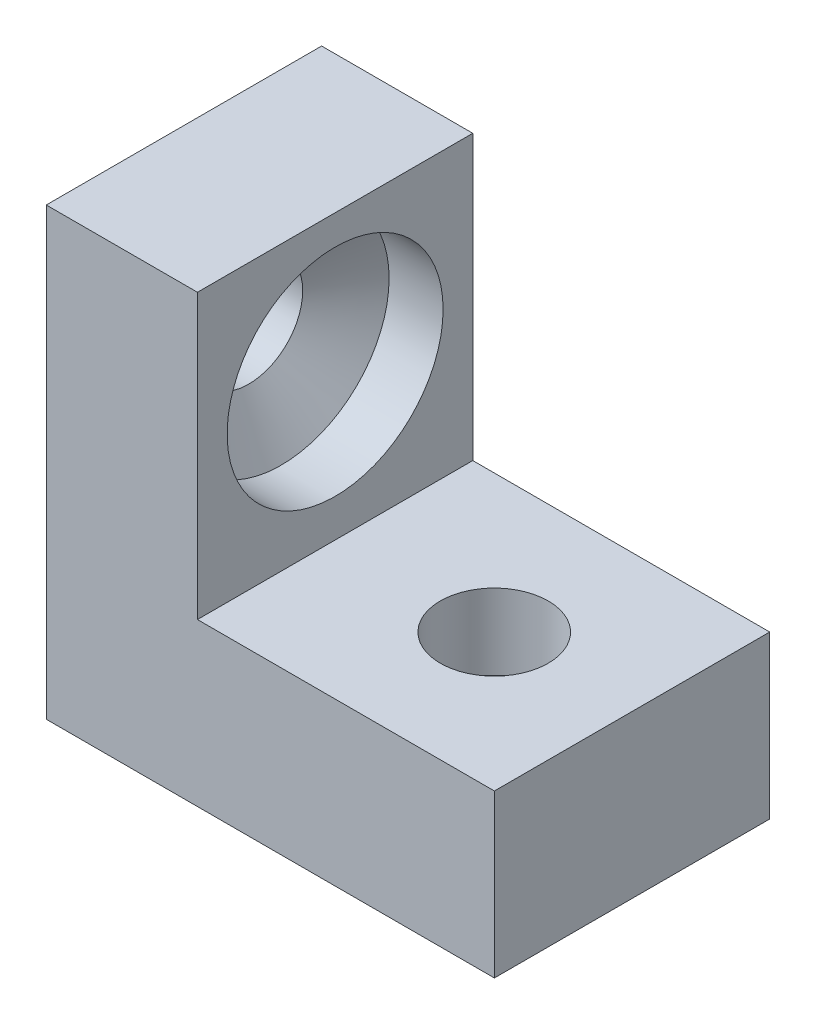
ISO-10303-21;
HEADER;
FILE_DESCRIPTION(('STEP AP214'),'2;1');
FILE_NAME('part.step','',(''),(''),'','','');
FILE_SCHEMA(('AUTOMOTIVE_DESIGN { 1 0 10303 214 1 1 1 1 }'));
ENDSEC;
DATA;
#1=APPLICATION_CONTEXT('core data for automotive mechanical design processes');
#2=APPLICATION_PROTOCOL_DEFINITION('international standard','automotive_design',2000,#1);
#3=PRODUCT_CONTEXT('',#1,'mechanical');
#4=PRODUCT('Part','Part','',(#3));
#5=PRODUCT_RELATED_PRODUCT_CATEGORY('part','',(#4));
#6=PRODUCT_DEFINITION_FORMATION('','',#4);
#7=PRODUCT_DEFINITION_CONTEXT('part definition',#1,'design');
#8=PRODUCT_DEFINITION('design','',#6,#7);
#9=PRODUCT_DEFINITION_SHAPE('','',#8);
#10=(LENGTH_UNIT() NAMED_UNIT(*) SI_UNIT(.MILLI.,.METRE.));
#11=(NAMED_UNIT(*) PLANE_ANGLE_UNIT() SI_UNIT($,.RADIAN.));
#12=(NAMED_UNIT(*) SI_UNIT($,.STERADIAN.) SOLID_ANGLE_UNIT());
#13=UNCERTAINTY_MEASURE_WITH_UNIT(LENGTH_MEASURE(1.E-05),#10,'distance_accuracy_value','');
#14=(GEOMETRIC_REPRESENTATION_CONTEXT(3) GLOBAL_UNCERTAINTY_ASSIGNED_CONTEXT((#13)) GLOBAL_UNIT_ASSIGNED_CONTEXT((#10,
#11,#12)) REPRESENTATION_CONTEXT('',''));
#15=CARTESIAN_POINT('',(0.,0.,0.));
#16=DIRECTION('',(0.,0.,1.));
#17=DIRECTION('',(1.,0.,0.));
#18=AXIS2_PLACEMENT_3D('',#15,#16,#17);
#19=CARTESIAN_POINT('',(0.,3.,0.));
#20=DIRECTION('',(0.,-1.,0.));
#21=DIRECTION('',(0.,0.,-1.));
#22=AXIS2_PLACEMENT_3D('',#19,#20,#21);
#23=PLANE('',#22);
#24=CARTESIAN_POINT('',(5.75023739748204,3.,-2.5473170362118));
#25=DIRECTION('',(0.,-1.,0.));
#26=DIRECTION('',(0.,0.,-1.));
#27=AXIS2_PLACEMENT_3D('',#24,#25,#26);
#28=CIRCLE('',#27,1.);
#29=CARTESIAN_POINT('',(5.75023739748204,3.,-3.54731703621181));
#30=VERTEX_POINT('',#29);
#31=EDGE_CURVE('E43',#30,#30,#28,.T.);
#32=ORIENTED_EDGE('',*,*,#31,.T.);
#33=EDGE_LOOP('',(#32));
#34=FACE_BOUND('',#33,.T.);
#35=DIRECTION('',(0.,0.,-1.));
#36=VECTOR('',#35,1.);
#37=CARTESIAN_POINT('',(2.8,3.,0.));
#38=LINE('',#37,#36);
#39=CARTESIAN_POINT('',(2.8,3.,0.));
#40=VERTEX_POINT('',#39);
#41=CARTESIAN_POINT('',(2.8,3.,-5.1));
#42=VERTEX_POINT('',#41);
#43=EDGE_CURVE('E56',#40,#42,#38,.T.);
#44=ORIENTED_EDGE('',*,*,#43,.F.);
#45=DIRECTION('',(1.,0.,0.));
#46=VECTOR('',#45,1.);
#47=CARTESIAN_POINT('',(0.,3.,0.));
#48=LINE('',#47,#46);
#49=CARTESIAN_POINT('',(8.3,3.,0.));
#50=VERTEX_POINT('',#49);
#51=EDGE_CURVE('E93',#40,#50,#48,.T.);
#52=ORIENTED_EDGE('',*,*,#51,.T.);
#53=DIRECTION('',(0.,0.,-1.));
#54=VECTOR('',#53,1.);
#55=CARTESIAN_POINT('',(8.3,3.,0.));
#56=LINE('',#55,#54);
#57=CARTESIAN_POINT('',(8.3,3.,-5.1));
#58=VERTEX_POINT('',#57);
#59=EDGE_CURVE('E62',#50,#58,#56,.T.);
#60=ORIENTED_EDGE('',*,*,#59,.T.);
#61=DIRECTION('',(-1.,0.,0.));
#62=VECTOR('',#61,1.);
#63=CARTESIAN_POINT('',(0.,3.,-5.1));
#64=LINE('',#63,#62);
#65=EDGE_CURVE('E103',#58,#42,#64,.T.);
#66=ORIENTED_EDGE('',*,*,#65,.T.);
#67=EDGE_LOOP('',(#44,#52,#60,#66));
#68=FACE_BOUND('',#67,.T.);
#69=ADVANCED_FACE('F39',(#34,#68),#23,.F.);
#70=CARTESIAN_POINT('',(0.,3.,0.));
#71=DIRECTION('',(1.,0.,0.));
#72=DIRECTION('',(0.,0.,-1.));
#73=AXIS2_PLACEMENT_3D('',#70,#71,#72);
#74=PLANE('',#73);
#75=CARTESIAN_POINT('',(0.,5.7,-2.55));
#76=DIRECTION('',(1.,0.,0.));
#77=DIRECTION('',(0.,0.,-1.));
#78=AXIS2_PLACEMENT_3D('',#75,#76,#77);
#79=CIRCLE('',#78,1.);
#80=CARTESIAN_POINT('',(0.,5.7,-3.55));
#81=VERTEX_POINT('',#80);
#82=EDGE_CURVE('E137',#81,#81,#79,.T.);
#83=ORIENTED_EDGE('',*,*,#82,.T.);
#84=EDGE_LOOP('',(#83));
#85=FACE_BOUND('',#84,.T.);
#86=DIRECTION('',(0.,0.,1.));
#87=VECTOR('',#86,1.);
#88=CARTESIAN_POINT('',(0.,0.,0.));
#89=LINE('',#88,#87);
#90=CARTESIAN_POINT('',(0.,0.,-5.1));
#91=VERTEX_POINT('',#90);
#92=CARTESIAN_POINT('',(0.,0.,0.));
#93=VERTEX_POINT('',#92);
#94=EDGE_CURVE('E100',#91,#93,#89,.T.);
#95=ORIENTED_EDGE('',*,*,#94,.T.);
#96=DIRECTION('',(0.,-1.,0.));
#97=VECTOR('',#96,1.);
#98=CARTESIAN_POINT('',(0.,3.,0.));
#99=LINE('',#98,#97);
#100=CARTESIAN_POINT('',(0.,8.25,0.));
#101=VERTEX_POINT('',#100);
#102=EDGE_CURVE('E11',#101,#93,#99,.T.);
#103=ORIENTED_EDGE('',*,*,#102,.F.);
#104=DIRECTION('',(0.,0.,1.));
#105=VECTOR('',#104,1.);
#106=CARTESIAN_POINT('',(0.,8.25,0.));
#107=LINE('',#106,#105);
#108=CARTESIAN_POINT('',(0.,8.25,-5.1));
#109=VERTEX_POINT('',#108);
#110=EDGE_CURVE('E102',#109,#101,#107,.T.);
#111=ORIENTED_EDGE('',*,*,#110,.F.);
#112=DIRECTION('',(0.,-1.,0.));
#113=VECTOR('',#112,1.);
#114=CARTESIAN_POINT('',(0.,3.,-5.1));
#115=LINE('',#114,#113);
#116=EDGE_CURVE('E86',#109,#91,#115,.T.);
#117=ORIENTED_EDGE('',*,*,#116,.T.);
#118=EDGE_LOOP('',(#95,#103,#111,#117));
#119=FACE_BOUND('',#118,.T.);
#120=ADVANCED_FACE('F41',(#85,#119),#74,.F.);
#121=CARTESIAN_POINT('',(0.,3.,0.));
#122=DIRECTION('',(0.,0.,-1.));
#123=DIRECTION('',(-1.,0.,0.));
#124=AXIS2_PLACEMENT_3D('',#121,#122,#123);
#125=PLANE('',#124);
#126=DIRECTION('',(1.,0.,0.));
#127=VECTOR('',#126,1.);
#128=CARTESIAN_POINT('',(0.,0.,0.));
#129=LINE('',#128,#127);
#130=CARTESIAN_POINT('',(8.3,0.,0.));
#131=VERTEX_POINT('',#130);
#132=EDGE_CURVE('E106',#93,#131,#129,.T.);
#133=ORIENTED_EDGE('',*,*,#132,.T.);
#134=DIRECTION('',(0.,-1.,0.));
#135=VECTOR('',#134,1.);
#136=CARTESIAN_POINT('',(8.3,3.,0.));
#137=LINE('',#136,#135);
#138=EDGE_CURVE('E48',#50,#131,#137,.T.);
#139=ORIENTED_EDGE('',*,*,#138,.F.);
#140=ORIENTED_EDGE('',*,*,#51,.F.);
#141=DIRECTION('',(0.,-1.,0.));
#142=VECTOR('',#141,1.);
#143=CARTESIAN_POINT('',(2.8,8.25,0.));
#144=LINE('',#143,#142);
#145=CARTESIAN_POINT('',(2.8,8.25,0.));
#146=VERTEX_POINT('',#145);
#147=EDGE_CURVE('E107',#146,#40,#144,.T.);
#148=ORIENTED_EDGE('',*,*,#147,.F.);
#149=DIRECTION('',(1.,0.,0.));
#150=VECTOR('',#149,1.);
#151=CARTESIAN_POINT('',(0.,8.25,0.));
#152=LINE('',#151,#150);
#153=EDGE_CURVE('E146',#101,#146,#152,.T.);
#154=ORIENTED_EDGE('',*,*,#153,.F.);
#155=ORIENTED_EDGE('',*,*,#102,.T.);
#156=EDGE_LOOP('',(#133,#139,#140,#148,#154,#155));
#157=FACE_BOUND('',#156,.T.);
#158=ADVANCED_FACE('F192',(#157),#125,.F.);
#159=CARTESIAN_POINT('',(8.3,3.,0.));
#160=DIRECTION('',(-1.,0.,0.));
#161=DIRECTION('',(0.,0.,1.));
#162=AXIS2_PLACEMENT_3D('',#159,#160,#161);
#163=PLANE('',#162);
#164=DIRECTION('',(0.,0.,-1.));
#165=VECTOR('',#164,1.);
#166=CARTESIAN_POINT('',(8.3,0.,0.));
#167=LINE('',#166,#165);
#168=CARTESIAN_POINT('',(8.3,0.,-5.1));
#169=VERTEX_POINT('',#168);
#170=EDGE_CURVE('E94',#131,#169,#167,.T.);
#171=ORIENTED_EDGE('',*,*,#170,.T.);
#172=DIRECTION('',(0.,-1.,0.));
#173=VECTOR('',#172,1.);
#174=CARTESIAN_POINT('',(8.3,3.,-5.1));
#175=LINE('',#174,#173);
#176=EDGE_CURVE('E89',#58,#169,#175,.T.);
#177=ORIENTED_EDGE('',*,*,#176,.F.);
#178=ORIENTED_EDGE('',*,*,#59,.F.);
#179=ORIENTED_EDGE('',*,*,#138,.T.);
#180=EDGE_LOOP('',(#171,#177,#178,#179));
#181=FACE_BOUND('',#180,.T.);
#182=ADVANCED_FACE('F184',(#181),#163,.F.);
#183=CARTESIAN_POINT('',(0.,3.,-5.1));
#184=DIRECTION('',(0.,0.,1.));
#185=DIRECTION('',(1.,0.,0.));
#186=AXIS2_PLACEMENT_3D('',#183,#184,#185);
#187=PLANE('',#186);
#188=DIRECTION('',(-1.,0.,0.));
#189=VECTOR('',#188,1.);
#190=CARTESIAN_POINT('',(0.,0.,-5.1));
#191=LINE('',#190,#189);
#192=EDGE_CURVE('E82',#169,#91,#191,.T.);
#193=ORIENTED_EDGE('',*,*,#192,.T.);
#194=ORIENTED_EDGE('',*,*,#116,.F.);
#195=DIRECTION('',(-1.,0.,0.));
#196=VECTOR('',#195,1.);
#197=CARTESIAN_POINT('',(0.,8.25,-5.1));
#198=LINE('',#197,#196);
#199=CARTESIAN_POINT('',(2.8,8.25,-5.1));
#200=VERTEX_POINT('',#199);
#201=EDGE_CURVE('E138',#200,#109,#198,.T.);
#202=ORIENTED_EDGE('',*,*,#201,.F.);
#203=DIRECTION('',(0.,-1.,0.));
#204=VECTOR('',#203,1.);
#205=CARTESIAN_POINT('',(2.8,8.25,-5.1));
#206=LINE('',#205,#204);
#207=EDGE_CURVE('E111',#200,#42,#206,.T.);
#208=ORIENTED_EDGE('',*,*,#207,.T.);
#209=ORIENTED_EDGE('',*,*,#65,.F.);
#210=ORIENTED_EDGE('',*,*,#176,.T.);
#211=EDGE_LOOP('',(#193,#194,#202,#208,#209,#210));
#212=FACE_BOUND('',#211,.T.);
#213=ADVANCED_FACE('F84',(#212),#187,.F.);
#214=CARTESIAN_POINT('',(0.,0.,0.));
#215=DIRECTION('',(0.,-1.,0.));
#216=DIRECTION('',(0.,0.,-1.));
#217=AXIS2_PLACEMENT_3D('',#214,#215,#216);
#218=PLANE('',#217);
#219=CARTESIAN_POINT('',(5.75023739748204,0.,-2.5473170362118));
#220=DIRECTION('',(0.,-1.,0.));
#221=DIRECTION('',(0.,0.,-1.));
#222=AXIS2_PLACEMENT_3D('',#219,#220,#221);
#223=CIRCLE('',#222,2.);
#224=CARTESIAN_POINT('',(5.75023739748204,0.,-4.54731703621181));
#225=VERTEX_POINT('',#224);
#226=EDGE_CURVE('E169',#225,#225,#223,.T.);
#227=ORIENTED_EDGE('',*,*,#226,.F.);
#228=EDGE_LOOP('',(#227));
#229=FACE_BOUND('',#228,.T.);
#230=ORIENTED_EDGE('',*,*,#94,.F.);
#231=ORIENTED_EDGE('',*,*,#192,.F.);
#232=ORIENTED_EDGE('',*,*,#170,.F.);
#233=ORIENTED_EDGE('',*,*,#132,.F.);
#234=EDGE_LOOP('',(#230,#231,#232,#233));
#235=FACE_BOUND('',#234,.T.);
#236=ADVANCED_FACE('F105',(#229,#235),#218,.T.);
#237=CARTESIAN_POINT('',(2.8,8.25,0.));
#238=DIRECTION('',(-1.,0.,0.));
#239=DIRECTION('',(0.,0.,1.));
#240=AXIS2_PLACEMENT_3D('',#237,#238,#239);
#241=PLANE('',#240);
#242=CARTESIAN_POINT('',(2.8,5.7,-2.55));
#243=DIRECTION('',(1.,0.,0.));
#244=DIRECTION('',(0.,0.,-1.));
#245=AXIS2_PLACEMENT_3D('',#242,#243,#244);
#246=CIRCLE('',#245,2.);
#247=CARTESIAN_POINT('',(2.8,5.7,-4.55));
#248=VERTEX_POINT('',#247);
#249=EDGE_CURVE('E160',#248,#248,#246,.T.);
#250=ORIENTED_EDGE('',*,*,#249,.F.);
#251=EDGE_LOOP('',(#250));
#252=FACE_BOUND('',#251,.T.);
#253=ORIENTED_EDGE('',*,*,#43,.T.);
#254=ORIENTED_EDGE('',*,*,#207,.F.);
#255=DIRECTION('',(0.,0.,-1.));
#256=VECTOR('',#255,1.);
#257=CARTESIAN_POINT('',(2.8,8.25,0.));
#258=LINE('',#257,#256);
#259=EDGE_CURVE('E140',#146,#200,#258,.T.);
#260=ORIENTED_EDGE('',*,*,#259,.F.);
#261=ORIENTED_EDGE('',*,*,#147,.T.);
#262=EDGE_LOOP('',(#253,#254,#260,#261));
#263=FACE_BOUND('',#262,.T.);
#264=ADVANCED_FACE('F133',(#252,#263),#241,.F.);
#265=CARTESIAN_POINT('',(0.,8.25,0.));
#266=DIRECTION('',(0.,-1.,0.));
#267=DIRECTION('',(0.,0.,-1.));
#268=AXIS2_PLACEMENT_3D('',#265,#266,#267);
#269=PLANE('',#268);
#270=ORIENTED_EDGE('',*,*,#110,.T.);
#271=ORIENTED_EDGE('',*,*,#153,.T.);
#272=ORIENTED_EDGE('',*,*,#259,.T.);
#273=ORIENTED_EDGE('',*,*,#201,.T.);
#274=EDGE_LOOP('',(#270,#271,#272,#273));
#275=FACE_BOUND('',#274,.T.);
#276=ADVANCED_FACE('F181',(#275),#269,.F.);
#277=CARTESIAN_POINT('',(2.8,5.7,-2.55));
#278=DIRECTION('',(1.,0.,0.));
#279=DIRECTION('',(0.,0.,-1.));
#280=AXIS2_PLACEMENT_3D('',#277,#278,#279);
#281=CYLINDRICAL_SURFACE('',#280,1.);
#282=ORIENTED_EDGE('',*,*,#82,.F.);
#283=EDGE_LOOP('',(#282));
#284=FACE_BOUND('',#283,.T.);
#285=CARTESIAN_POINT('',(1.19913938097244,5.7,-2.55));
#286=DIRECTION('',(1.,0.,0.));
#287=DIRECTION('',(0.,0.,-1.));
#288=AXIS2_PLACEMENT_3D('',#285,#286,#287);
#289=CIRCLE('',#288,1.);
#290=CARTESIAN_POINT('',(1.19913938097244,5.7,-3.55));
#291=VERTEX_POINT('',#290);
#292=EDGE_CURVE('E154',#291,#291,#289,.T.);
#293=ORIENTED_EDGE('',*,*,#292,.T.);
#294=EDGE_LOOP('',(#293));
#295=FACE_BOUND('',#294,.T.);
#296=ADVANCED_FACE('F198',(#284,#295),#281,.F.);
#297=CARTESIAN_POINT('',(1.8,5.7,-2.55));
#298=DIRECTION('',(1.,0.,0.));
#299=DIRECTION('',(0.,0.,-1.));
#300=AXIS2_PLACEMENT_3D('',#297,#298,#299);
#301=CONICAL_SURFACE('',#300,2.,1.02974425867666);
#302=ORIENTED_EDGE('',*,*,#292,.F.);
#303=EDGE_LOOP('',(#302));
#304=FACE_BOUND('',#303,.T.);
#305=CARTESIAN_POINT('',(1.8,5.7,-2.55));
#306=DIRECTION('',(1.,0.,0.));
#307=DIRECTION('',(0.,0.,-1.));
#308=AXIS2_PLACEMENT_3D('',#305,#306,#307);
#309=CIRCLE('',#308,2.);
#310=CARTESIAN_POINT('',(1.8,5.7,-4.55));
#311=VERTEX_POINT('',#310);
#312=EDGE_CURVE('E157',#311,#311,#309,.T.);
#313=ORIENTED_EDGE('',*,*,#312,.T.);
#314=EDGE_LOOP('',(#313));
#315=FACE_BOUND('',#314,.T.);
#316=ADVANCED_FACE('F201',(#304,#315),#301,.F.);
#317=CARTESIAN_POINT('',(2.8,5.7,-2.55));
#318=DIRECTION('',(1.,0.,0.));
#319=DIRECTION('',(0.,0.,-1.));
#320=AXIS2_PLACEMENT_3D('',#317,#318,#319);
#321=CYLINDRICAL_SURFACE('',#320,2.);
#322=ORIENTED_EDGE('',*,*,#312,.F.);
#323=EDGE_LOOP('',(#322));
#324=FACE_BOUND('',#323,.T.);
#325=ORIENTED_EDGE('',*,*,#249,.T.);
#326=EDGE_LOOP('',(#325));
#327=FACE_BOUND('',#326,.T.);
#328=ADVANCED_FACE('F205',(#324,#327),#321,.F.);
#329=CARTESIAN_POINT('',(5.75023739748204,0.,-2.5473170362118));
#330=DIRECTION('',(0.,-1.,0.));
#331=DIRECTION('',(0.,0.,-1.));
#332=AXIS2_PLACEMENT_3D('',#329,#330,#331);
#333=CYLINDRICAL_SURFACE('',#332,1.);
#334=CARTESIAN_POINT('',(5.75023739748204,1.60086061902755,-2.5473170362118));
#335=DIRECTION('',(0.,-1.,0.));
#336=DIRECTION('',(0.,0.,-1.));
#337=AXIS2_PLACEMENT_3D('',#334,#335,#336);
#338=CIRCLE('',#337,1.);
#339=CARTESIAN_POINT('',(5.75023739748204,1.60086061902755,-3.54731703621181));
#340=VERTEX_POINT('',#339);
#341=EDGE_CURVE('E163',#340,#340,#338,.T.);
#342=ORIENTED_EDGE('',*,*,#341,.T.);
#343=EDGE_LOOP('',(#342));
#344=FACE_BOUND('',#343,.T.);
#345=ORIENTED_EDGE('',*,*,#31,.F.);
#346=EDGE_LOOP('',(#345));
#347=FACE_BOUND('',#346,.T.);
#348=ADVANCED_FACE('F209',(#344,#347),#333,.F.);
#349=CARTESIAN_POINT('',(5.75023739748204,0.999999999999997,-2.5473170362118));
#350=DIRECTION('',(0.,-1.,0.));
#351=DIRECTION('',(0.,0.,-1.));
#352=AXIS2_PLACEMENT_3D('',#349,#350,#351);
#353=CONICAL_SURFACE('',#352,2.,1.02974425867666);
#354=ORIENTED_EDGE('',*,*,#341,.F.);
#355=EDGE_LOOP('',(#354));
#356=FACE_BOUND('',#355,.T.);
#357=CARTESIAN_POINT('',(5.75023739748204,0.999999999999997,-2.5473170362118));
#358=DIRECTION('',(0.,-1.,0.));
#359=DIRECTION('',(0.,0.,-1.));
#360=AXIS2_PLACEMENT_3D('',#357,#358,#359);
#361=CIRCLE('',#360,2.);
#362=CARTESIAN_POINT('',(5.75023739748204,0.999999999999997,-4.54731703621181));
#363=VERTEX_POINT('',#362);
#364=EDGE_CURVE('E166',#363,#363,#361,.T.);
#365=ORIENTED_EDGE('',*,*,#364,.T.);
#366=EDGE_LOOP('',(#365));
#367=FACE_BOUND('',#366,.T.);
#368=ADVANCED_FACE('F213',(#356,#367),#353,.F.);
#369=CARTESIAN_POINT('',(5.75023739748204,0.,-2.5473170362118));
#370=DIRECTION('',(0.,-1.,0.));
#371=DIRECTION('',(0.,0.,-1.));
#372=AXIS2_PLACEMENT_3D('',#369,#370,#371);
#373=CYLINDRICAL_SURFACE('',#372,2.);
#374=ORIENTED_EDGE('',*,*,#364,.F.);
#375=EDGE_LOOP('',(#374));
#376=FACE_BOUND('',#375,.T.);
#377=ORIENTED_EDGE('',*,*,#226,.T.);
#378=EDGE_LOOP('',(#377));
#379=FACE_BOUND('',#378,.T.);
#380=ADVANCED_FACE('F173',(#376,#379),#373,.F.);
#381=CLOSED_SHELL('',(#69,#120,#158,#182,#213,#236,#264,#276,#296,#316,#328,#348,#368,#380));
#382=MANIFOLD_SOLID_BREP('B2',#381);
#383=ADVANCED_BREP_SHAPE_REPRESENTATION('',(#18,#382),#14);
#384=SHAPE_DEFINITION_REPRESENTATION(#9,#383);
ENDSEC;
END-ISO-10303-21;
